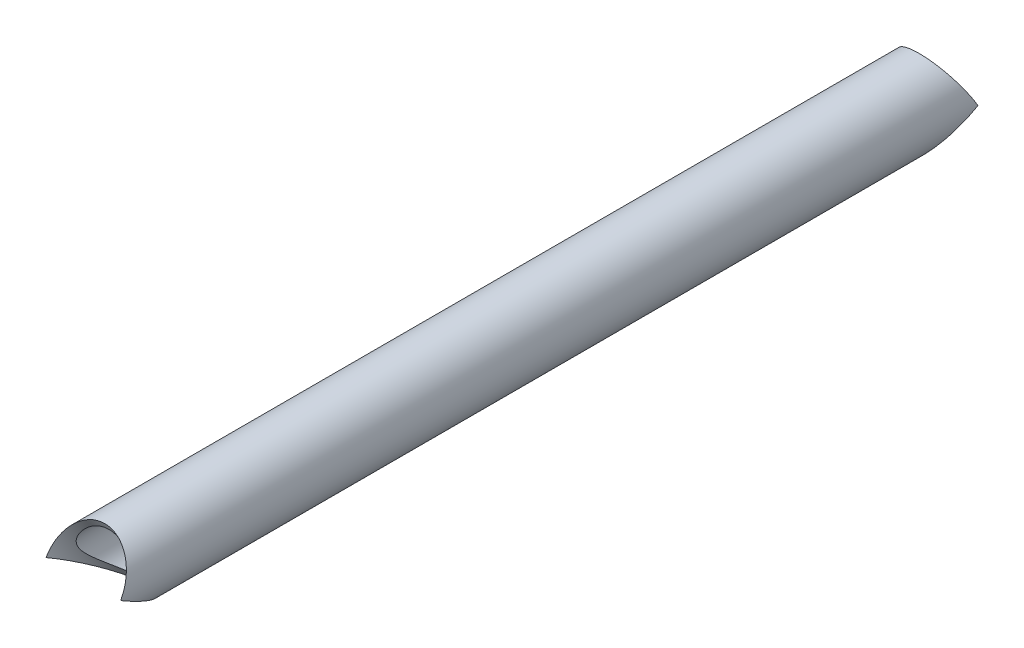
ISO-10303-21;
HEADER;
FILE_DESCRIPTION(('STEP AP214'),'2;1');
FILE_NAME('part.step','',(''),(''),'','','');
FILE_SCHEMA(('AUTOMOTIVE_DESIGN { 1 0 10303 214 1 1 1 1 }'));
ENDSEC;
DATA;
#1=APPLICATION_CONTEXT('core data for automotive mechanical design processes');
#2=APPLICATION_PROTOCOL_DEFINITION('international standard','automotive_design',2000,#1);
#3=PRODUCT_CONTEXT('',#1,'mechanical');
#4=PRODUCT('Part','Part','',(#3));
#5=PRODUCT_RELATED_PRODUCT_CATEGORY('part','',(#4));
#6=PRODUCT_DEFINITION_FORMATION('','',#4);
#7=PRODUCT_DEFINITION_CONTEXT('part definition',#1,'design');
#8=PRODUCT_DEFINITION('design','',#6,#7);
#9=PRODUCT_DEFINITION_SHAPE('','',#8);
#10=(LENGTH_UNIT() NAMED_UNIT(*) SI_UNIT(.MILLI.,.METRE.));
#11=(NAMED_UNIT(*) PLANE_ANGLE_UNIT() SI_UNIT($,.RADIAN.));
#12=(NAMED_UNIT(*) SI_UNIT($,.STERADIAN.) SOLID_ANGLE_UNIT());
#13=UNCERTAINTY_MEASURE_WITH_UNIT(LENGTH_MEASURE(1.E-05),#10,'distance_accuracy_value','');
#14=(GEOMETRIC_REPRESENTATION_CONTEXT(3) GLOBAL_UNCERTAINTY_ASSIGNED_CONTEXT((#13)) GLOBAL_UNIT_ASSIGNED_CONTEXT((#10,
#11,#12)) REPRESENTATION_CONTEXT('',''));
#15=CARTESIAN_POINT('',(0.,0.,0.));
#16=DIRECTION('',(0.,0.,1.));
#17=DIRECTION('',(1.,0.,0.));
#18=AXIS2_PLACEMENT_3D('',#15,#16,#17);
#19=CARTESIAN_POINT('',(0.,-4.57499999978753,-134.224170550296));
#20=DIRECTION('',(0.,0.,1.));
#21=DIRECTION('',(1.,0.,0.));
#22=AXIS2_PLACEMENT_3D('',#19,#20,#21);
#23=CYLINDRICAL_SURFACE('',#22,10.65);
#24=CARTESIAN_POINT('',(0.,-4.57499999978753,-122.358622518568));
#25=DIRECTION('',(0.,0.866025403784403,0.500000000000061));
#26=DIRECTION('',(0.,-0.500000000000061,0.866025403784403));
#27=AXIS2_PLACEMENT_3D('',#24,#25,#26);
#28=ELLIPSE('',#27,21.2999999999974,10.65);
#29=CARTESIAN_POINT('',(-10.65,-4.57499999978753,-122.358622518568));
#30=VERTEX_POINT('',#29);
#31=CARTESIAN_POINT('',(10.65,-4.57499999978753,-122.358622518568));
#32=VERTEX_POINT('',#31);
#33=EDGE_CURVE('E40',#30,#32,#28,.T.);
#34=ORIENTED_EDGE('',*,*,#33,.T.);
#35=CARTESIAN_POINT('',(0.,-4.57499999978753,-122.358622518568));
#36=DIRECTION('',(0.,-0.500000000000061,0.866025403784403));
#37=DIRECTION('',(0.,0.866025403784403,0.500000000000061));
#38=AXIS2_PLACEMENT_3D('',#35,#36,#37);
#39=ELLIPSE('',#38,12.2975607337395,10.65);
#40=EDGE_CURVE('E46',#32,#30,#39,.T.);
#41=ORIENTED_EDGE('',*,*,#40,.T.);
#42=EDGE_LOOP('',(#34,#41));
#43=FACE_BOUND('',#42,.T.);
#44=CARTESIAN_POINT('',(0.,-4.57499999978753,122.358622518568));
#45=DIRECTION('',(0.,-0.866025403784403,0.500000000000061));
#46=DIRECTION('',(0.,-0.500000000000061,-0.866025403784403));
#47=AXIS2_PLACEMENT_3D('',#44,#45,#46);
#48=ELLIPSE('',#47,21.2999999999974,10.65);
#49=CARTESIAN_POINT('',(-10.65,-4.57499999978753,122.358622518568));
#50=VERTEX_POINT('',#49);
#51=CARTESIAN_POINT('',(10.65,-4.57499999978753,122.358622518568));
#52=VERTEX_POINT('',#51);
#53=EDGE_CURVE('E65',#50,#52,#48,.T.);
#54=ORIENTED_EDGE('',*,*,#53,.F.);
#55=CARTESIAN_POINT('',(0.,-4.57499999978753,122.358622518568));
#56=DIRECTION('',(0.,0.500000000000061,0.866025403784403));
#57=DIRECTION('',(0.,0.866025403784403,-0.500000000000061));
#58=AXIS2_PLACEMENT_3D('',#55,#56,#57);
#59=ELLIPSE('',#58,12.2975607337395,10.65);
#60=EDGE_CURVE('E61',#52,#50,#59,.T.);
#61=ORIENTED_EDGE('',*,*,#60,.F.);
#62=EDGE_LOOP('',(#54,#61));
#63=FACE_BOUND('',#62,.T.);
#64=ADVANCED_FACE('F35',(#43,#63),#23,.T.);
#65=CARTESIAN_POINT('',(0.,-4.57499999978753,-134.224170550296));
#66=DIRECTION('',(0.,0.,1.));
#67=DIRECTION('',(1.,0.,0.));
#68=AXIS2_PLACEMENT_3D('',#65,#66,#67);
#69=CYLINDRICAL_SURFACE('',#68,8.65);
#70=CARTESIAN_POINT('',(8.65,-4.57499999978753,-115.184595290668));
#71=CARTESIAN_POINT('',(8.64999937803326,-4.42818391782851,-115.269359582951));
#72=CARTESIAN_POINT('',(8.64626274910706,-4.27875572457402,-115.349611641541));
#73=CARTESIAN_POINT('',(8.63051404007006,-3.97515065123676,-115.499677454161));
#74=CARTESIAN_POINT('',(8.61850310980504,-3.82097443381099,-115.569492656918));
#75=CARTESIAN_POINT('',(8.58549136002908,-3.50897766796468,-115.697404729086));
#76=CARTESIAN_POINT('',(8.56450206368755,-3.35116203529276,-115.755516479015));
#77=CARTESIAN_POINT('',(8.51297710355421,-3.03302790263824,-115.859376778032));
#78=CARTESIAN_POINT('',(8.48244146927592,-2.87270941039494,-115.905125365343));
#79=CARTESIAN_POINT('',(8.41148621827915,-2.55100459486539,-115.984163592341));
#80=CARTESIAN_POINT('',(8.37105601253787,-2.38961730900032,-116.017439787035));
#81=CARTESIAN_POINT('',(8.2803069748769,-2.06761051815601,-116.071985794572));
#82=CARTESIAN_POINT('',(8.22998781020885,-1.90699103919864,-116.093255203313));
#83=CARTESIAN_POINT('',(8.11955918288833,-1.58771822942159,-116.124881415479));
#84=CARTESIAN_POINT('',(8.05943008935704,-1.4290695419311,-116.135216020047));
#85=CARTESIAN_POINT('',(7.92980127101956,-1.11529040421041,-116.146305579687));
#86=CARTESIAN_POINT('',(7.86029883349651,-0.960160987723778,-116.147057755494));
#87=CARTESIAN_POINT('',(7.69251740767304,-0.613430150721972,-116.139638484842));
#88=CARTESIAN_POINT('',(7.5915181509432,-0.423195720267686,-116.129021588862));
#89=CARTESIAN_POINT('',(7.37601667855867,-0.0513849148464291,-116.097916278314));
#90=CARTESIAN_POINT('',(7.26151062378719,0.130188977789838,-116.077425051977));
#91=CARTESIAN_POINT('',(7.01974442801424,0.483814001583903,-116.029302594631));
#92=CARTESIAN_POINT('',(6.89247464409701,0.655857778142641,-116.001665940042));
#93=CARTESIAN_POINT('',(6.62602035216088,0.989525172214685,-115.941620573317));
#94=CARTESIAN_POINT('',(6.48683667995883,1.15114951930896,-115.909212195827));
#95=CARTESIAN_POINT('',(6.19369921715696,1.46719940914524,-115.84077746214));
#96=CARTESIAN_POINT('',(6.03946719637203,1.6213517424231,-115.804681942267));
#97=CARTESIAN_POINT('',(5.71996280967908,1.91745458219681,-115.731350690768));
#98=CARTESIAN_POINT('',(5.55469039583108,2.05940503570313,-115.694114954191));
#99=CARTESIAN_POINT('',(5.21389860047887,2.33044322956149,-115.620013536865));
#100=CARTESIAN_POINT('',(5.03838164399918,2.45953399455306,-115.583147770942));
#101=CARTESIAN_POINT('',(4.67787691764106,2.70424676301921,-115.511048435588));
#102=CARTESIAN_POINT('',(4.49288897525142,2.81986852103409,-115.475814895909));
#103=CARTESIAN_POINT('',(4.08963935720715,3.05115050125581,-115.403646125226));
#104=CARTESIAN_POINT('',(3.87018262639214,3.16485316154516,-115.36708724701));
#105=CARTESIAN_POINT('',(3.42170434916093,3.37330748111037,-115.29875117079));
#106=CARTESIAN_POINT('',(3.19268197861112,3.46805750342191,-115.266974385882));
#107=CARTESIAN_POINT('',(2.72667233822049,3.63774898245599,-115.209273205541));
#108=CARTESIAN_POINT('',(2.48968464132694,3.71268937519016,-115.183349124472));
#109=CARTESIAN_POINT('',(2.00954587057521,3.84200831187236,-115.138198861622));
#110=CARTESIAN_POINT('',(1.76639521488977,3.89638824693665,-115.118972226702));
#111=CARTESIAN_POINT('',(1.28688815577942,3.9820463765204,-115.088524345823));
#112=CARTESIAN_POINT('',(1.05071773862521,4.01425324205799,-115.07698206285));
#113=CARTESIAN_POINT('',(0.576287751521718,4.05906969952122,-115.060889240509));
#114=CARTESIAN_POINT('',(0.338028232848634,4.07167977109606,-115.056338530015));
#115=CARTESIAN_POINT('',(-0.138694398066298,4.07717181040764,-115.054358695336));
#116=CARTESIAN_POINT('',(-0.377157454410708,4.07005809051707,-115.056928014441));
#117=CARTESIAN_POINT('',(-0.852499060908978,4.03618555835059,-115.069111908876));
#118=CARTESIAN_POINT('',(-1.08937763950014,4.00942709960698,-115.07872635742));
#119=CARTESIAN_POINT('',(-1.55084699910065,3.93792048431375,-115.104232336492));
#120=CARTESIAN_POINT('',(-1.7755636187999,3.89389120657831,-115.11987263369));
#121=CARTESIAN_POINT('',(-2.22033596035186,3.78830373548739,-115.157001396638));
#122=CARTESIAN_POINT('',(-2.44039182888971,3.72674609467534,-115.178489678042));
#123=CARTESIAN_POINT('',(-2.8743918221649,3.58663978925965,-115.226728859725));
#124=CARTESIAN_POINT('',(-3.08833678882607,3.50809347816174,-115.253479031008));
#125=CARTESIAN_POINT('',(-3.50884695015105,3.33462882693908,-115.311498656313));
#126=CARTESIAN_POINT('',(-3.7154119251496,3.23970999997611,-115.342768244716));
#127=CARTESIAN_POINT('',(-4.12561504865977,3.03132550301985,-115.409837232953));
#128=CARTESIAN_POINT('',(-4.32901148650182,2.9174169410633,-115.445738531183));
#129=CARTESIAN_POINT('',(-4.7256099642525,2.67381198994636,-115.520168916756));
#130=CARTESIAN_POINT('',(-4.91881176220239,2.54411522631147,-115.558698066418));
#131=CARTESIAN_POINT('',(-5.29426000335308,2.26952202344384,-115.637032028229));
#132=CARTESIAN_POINT('',(-5.4764901297915,2.12460378481456,-115.676838611637));
#133=CARTESIAN_POINT('',(-5.82873985001166,1.82050122106844,-115.755988555436));
#134=CARTESIAN_POINT('',(-5.99875927649522,1.66131670055716,-115.795331909472));
#135=CARTESIAN_POINT('',(-6.33518765877074,1.31979767164411,-115.873753491672));
#136=CARTESIAN_POINT('',(-6.50081325634466,1.13665555943424,-115.912683576386));
#137=CARTESIAN_POINT('',(-6.81634213928584,0.756141739161809,-115.98486806124));
#138=CARTESIAN_POINT('',(-6.96624167784347,0.558766658841185,-116.018121109976));
#139=CARTESIAN_POINT('',(-7.24880778217058,0.151373762699139,-116.075315328043));
#140=CARTESIAN_POINT('',(-7.38151120832292,-0.0586155499751075,-116.099276641938));
#141=CARTESIAN_POINT('',(-7.62872444595338,-0.490057474007726,-116.133719500269));
#142=CARTESIAN_POINT('',(-7.74324661530789,-0.711502162187991,-116.144210235388));
#143=CARTESIAN_POINT('',(-7.91587661528823,-1.08394120060869,-116.146466563869));
#144=CARTESIAN_POINT('',(-7.97965328460164,-1.23229882149715,-116.143523213445));
#145=CARTESIAN_POINT('',(-8.09865941914437,-1.53194667156995,-116.128671454996));
#146=CARTESIAN_POINT('',(-8.15389168150628,-1.68323592271582,-116.116765988366));
#147=CARTESIAN_POINT('',(-8.25543809691553,-1.98735751091624,-116.082863897547));
#148=CARTESIAN_POINT('',(-8.30176915263798,-2.14018633155486,-116.060886673073));
#149=CARTESIAN_POINT('',(-8.38549388456925,-2.44634433783993,-116.005998636864));
#150=CARTESIAN_POINT('',(-8.42288752849283,-2.59967352529188,-115.973087785633));
#151=CARTESIAN_POINT('',(-8.48887463244825,-2.90583736976603,-115.895832618932));
#152=CARTESIAN_POINT('',(-8.51744234753774,-3.05866931695996,-115.851455535505));
#153=CARTESIAN_POINT('',(-8.56590540255695,-3.362002990232,-115.75146979544));
#154=CARTESIAN_POINT('',(-8.58580081854741,-3.51250473673607,-115.695861237313));
#155=CARTESIAN_POINT('',(-8.61742448664859,-3.81019147234697,-115.574008714786));
#156=CARTESIAN_POINT('',(-8.62914387610778,-3.95737269542241,-115.507753304792));
#157=CARTESIAN_POINT('',(-8.64501885033618,-4.24748069406385,-115.365671481828));
#158=CARTESIAN_POINT('',(-8.64917188260002,-4.39040601791679,-115.289841848222));
#159=CARTESIAN_POINT('',(-8.65091176420886,-4.73194986356799,-115.095442482579));
#160=CARTESIAN_POINT('',(-8.64490991978812,-4.92810720200213,-114.972509514161));
#161=CARTESIAN_POINT('',(-8.62080404537331,-5.31052557364032,-114.713198540494));
#162=CARTESIAN_POINT('',(-8.60269349220144,-5.49678121420754,-114.576813322057));
#163=CARTESIAN_POINT('',(-8.55591593176149,-5.86050738577944,-114.293378957805));
#164=CARTESIAN_POINT('',(-8.52721453919814,-6.03794714098358,-114.146296343747));
#165=CARTESIAN_POINT('',(-8.46048539057334,-6.38436872164175,-113.844423533046));
#166=CARTESIAN_POINT('',(-8.4224538533154,-6.55334708446049,-113.689630231839));
#167=CARTESIAN_POINT('',(-8.33930780952947,-6.87840220783153,-113.379540475325));
#168=CARTESIAN_POINT('',(-8.29446233610359,-7.03471951579418,-113.224422399952));
#169=CARTESIAN_POINT('',(-8.19738755510059,-7.34107106220538,-112.910412577411));
#170=CARTESIAN_POINT('',(-8.1451593511144,-7.49110623538767,-112.751521397205));
#171=CARTESIAN_POINT('',(-8.03358147622644,-7.7857481982702,-112.430951737262));
#172=CARTESIAN_POINT('',(-7.97422521882754,-7.93034980273499,-112.269270799675));
#173=CARTESIAN_POINT('',(-7.84858289044829,-8.21455859783765,-111.94419577846));
#174=CARTESIAN_POINT('',(-7.78229605383354,-8.35416523438043,-111.780801507356));
#175=CARTESIAN_POINT('',(-7.64278789689211,-8.62889196654412,-111.453020171442));
#176=CARTESIAN_POINT('',(-7.56956237191914,-8.764009273919,-111.28863256191));
#177=CARTESIAN_POINT('',(-7.41613086611596,-9.03000589083587,-110.959658622605));
#178=CARTESIAN_POINT('',(-7.33592422353147,-9.16088479699427,-110.795072275454));
#179=CARTESIAN_POINT('',(-7.1684296718615,-9.41852229357201,-110.466486599006));
#180=CARTESIAN_POINT('',(-7.08114669097994,-9.54528366685799,-110.30248694283));
#181=CARTESIAN_POINT('',(-6.89920629382398,-9.79489446757355,-109.975604082763));
#182=CARTESIAN_POINT('',(-6.80454875727009,-9.91774383115193,-109.81272089713));
#183=CARTESIAN_POINT('',(-6.56519981119286,-10.2115247673278,-109.419089662994));
#184=CARTESIAN_POINT('',(-6.4164866166655,-10.3804340930315,-109.189255185855));
#185=CARTESIAN_POINT('',(-6.10210401419186,-10.710038619871,-108.735247254382));
#186=CARTESIAN_POINT('',(-5.936432047359,-10.8707325758995,-108.511074660743));
#187=CARTESIAN_POINT('',(-5.58706670598721,-11.1827156749228,-108.071455876805));
#188=CARTESIAN_POINT('',(-5.40341885193567,-11.3340270659939,-107.855989501212));
#189=CARTESIAN_POINT('',(-5.01605964051009,-11.626275897711,-107.43639426222));
#190=CARTESIAN_POINT('',(-4.81235869354437,-11.7672186554388,-107.232259601236));
#191=CARTESIAN_POINT('',(-4.46395431537833,-11.9858360007998,-106.913503767282));
#192=CARTESIAN_POINT('',(-4.32596965085854,-12.0673265351517,-106.794155605259));
#193=CARTESIAN_POINT('',(-4.04104693269514,-12.2247682170259,-106.562720595489));
#194=CARTESIAN_POINT('',(-3.89410768994091,-12.3007186258999,-106.450634716222));
#195=CARTESIAN_POINT('',(-3.43953622820845,-12.5188634309986,-106.127674094581));
#196=CARTESIAN_POINT('',(-3.11767000653627,-12.651660528872,-105.929643891487));
#197=CARTESIAN_POINT('',(-2.51329904826432,-12.8564868215799,-105.622940907413));
#198=CARTESIAN_POINT('',(-2.23837288737339,-12.9354670462491,-105.504188010366));
#199=CARTESIAN_POINT('',(-1.81149183588577,-13.0344559438192,-105.355036540102));
#200=CARTESIAN_POINT('',(-1.66677696284483,-13.0642061116125,-105.310147851528));
#201=CARTESIAN_POINT('',(-1.37323763265842,-13.1165986631685,-105.231026788349));
#202=CARTESIAN_POINT('',(-1.22441515227444,-13.1392444031762,-105.196789381972));
#203=CARTESIAN_POINT('',(-0.922228530535095,-13.1770575524397,-105.139588825089));
#204=CARTESIAN_POINT('',(-0.768835207762983,-13.1921542685189,-105.116732259101));
#205=CARTESIAN_POINT('',(-0.460111209939372,-13.2141399654113,-105.083437225818));
#206=CARTESIAN_POINT('',(-0.304780550296975,-13.2210290114643,-105.072998659817));
#207=CARTESIAN_POINT('',(0.00631804623090696,-13.2263962341463,-105.064866473382));
#208=CARTESIAN_POINT('',(0.162085851106527,-13.2248767234323,-105.067169348591));
#209=CARTESIAN_POINT('',(0.472597570432571,-13.2134770715357,-105.084439707225));
#210=CARTESIAN_POINT('',(0.627341552834102,-13.2035974909364,-105.099406341483));
#211=CARTESIAN_POINT('',(0.914629127248828,-13.1775579321688,-105.138827462022));
#212=CARTESIAN_POINT('',(1.04746675019241,-13.16236989747,-105.161812937903));
#213=CARTESIAN_POINT('',(1.31053948151333,-13.1261774916188,-105.216542934459));
#214=CARTESIAN_POINT('',(1.44077378597027,-13.1051713526657,-105.248290117323));
#215=CARTESIAN_POINT('',(1.82650942834298,-13.033997007677,-105.35575133905));
#216=CARTESIAN_POINT('',(2.07716005820092,-12.975661801231,-105.443701876901));
#217=CARTESIAN_POINT('',(2.67701044964108,-12.8087067367557,-105.694647317451));
#218=CARTESIAN_POINT('',(3.01657143771813,-12.6893597724725,-105.873450719254));
#219=CARTESIAN_POINT('',(3.49694388024296,-12.4885470084001,-106.172360442701));
#220=CARTESIAN_POINT('',(3.6524529174968,-12.4178539230088,-106.277296443481));
#221=CARTESIAN_POINT('',(3.95415605806183,-12.2701478758393,-106.495775727814));
#222=CARTESIAN_POINT('',(4.10035178316862,-12.1931360197684,-106.609317505198));
#223=CARTESIAN_POINT('',(4.47217067277701,-11.9839136249407,-106.91654415232));
#224=CARTESIAN_POINT('',(4.69046621582068,-11.8472318741004,-107.116048636398));
#225=CARTESIAN_POINT('',(5.10542040241963,-11.5621722292248,-107.528787955197));
#226=CARTESIAN_POINT('',(5.3020644582469,-11.4137865637986,-107.742031895405));
#227=CARTESIAN_POINT('',(5.67619689273711,-11.1066202485955,-108.179190065514));
#228=CARTESIAN_POINT('',(5.85361633779411,-10.9478052712788,-108.403138796496));
#229=CARTESIAN_POINT('',(6.19021131259969,-10.6213821224164,-108.858053693496));
#230=CARTESIAN_POINT('',(6.34939068740902,-10.4537758150089,-109.089018367498));
#231=CARTESIAN_POINT('',(6.61712450602692,-10.1488278052138,-109.503286919531));
#232=CARTESIAN_POINT('',(6.72902472853526,-10.0131322706414,-109.685658473889));
#233=CARTESIAN_POINT('',(6.94326792392691,-9.73679289975961,-110.052292614882));
#234=CARTESIAN_POINT('',(7.04560988610065,-9.59614854231181,-110.236555399219));
#235=CARTESIAN_POINT('',(7.24122557898454,-9.30968727094873,-110.606213334335));
#236=CARTESIAN_POINT('',(7.33449006193027,-9.16386528441821,-110.791609439563));
#237=CARTESIAN_POINT('',(7.51210861764644,-8.86692902916769,-111.162414886722));
#238=CARTESIAN_POINT('',(7.59646314201647,-8.71581502918986,-111.347824227505));
#239=CARTESIAN_POINT('',(7.75620337110361,-8.40824485920786,-111.71720792965));
#240=CARTESIAN_POINT('',(7.83161100983146,-8.25180301704611,-111.901184721975));
#241=CARTESIAN_POINT('',(7.97368173187743,-7.9325925750132,-112.267069013673));
#242=CARTESIAN_POINT('',(8.04034383363397,-7.76982326762756,-112.448976278681));
#243=CARTESIAN_POINT('',(8.16459670931701,-7.43739573445011,-112.809097529655));
#244=CARTESIAN_POINT('',(8.22219981237256,-7.26774727387101,-112.987316243524));
#245=CARTESIAN_POINT('',(8.32794134031472,-6.92039006324778,-113.338573882142));
#246=CARTESIAN_POINT('',(8.37608284212221,-6.74268395677065,-113.51161447525));
#247=CARTESIAN_POINT('',(8.45472823516461,-6.40916947821612,-113.821387897599));
#248=CARTESIAN_POINT('',(8.48684042866996,-6.25481212034765,-113.959269931842));
#249=CARTESIAN_POINT('',(8.54328935211189,-5.93898150852449,-114.228383168529));
#250=CARTESIAN_POINT('',(8.56762596647505,-5.77750814884069,-114.359614272091));
#251=CARTESIAN_POINT('',(8.60751619567126,-5.44721879344272,-114.61310351662));
#252=CARTESIAN_POINT('',(8.62309164938045,-5.27842219503451,-114.735383301947));
#253=CARTESIAN_POINT('',(8.6443326388658,-4.93273682239824,-114.968920809705));
#254=CARTESIAN_POINT('',(8.65000076614763,-4.7558501767481,-115.080181407292));
#255=CARTESIAN_POINT('',(8.65,-4.57499999978753,-115.184595290668));
#256=B_SPLINE_CURVE_WITH_KNOTS('',3,(#70,#71,#72,#73,#74,#75,#76,#77,#78,#79,#80,#81,#82,#83,
#84,#85,#86,#87,#88,#89,#90,#91,#92,#93,#94,#95,#96,#97,#98,#99,#100,#101,#102,#103,#104,#105,
#106,#107,#108,#109,#110,#111,#112,#113,#114,#115,#116,#117,#118,#119,#120,#121,#122,#123,#124,
#125,#126,#127,#128,#129,#130,#131,#132,#133,#134,#135,#136,#137,#138,#139,#140,#141,#142,#143,
#144,#145,#146,#147,#148,#149,#150,#151,#152,#153,#154,#155,#156,#157,#158,#159,#160,#161,#162,
#163,#164,#165,#166,#167,#168,#169,#170,#171,#172,#173,#174,#175,#176,#177,#178,#179,#180,#181,
#182,#183,#184,#185,#186,#187,#188,#189,#190,#191,#192,#193,#194,#195,#196,#197,#198,#199,#200,
#201,#202,#203,#204,#205,#206,#207,#208,#209,#210,#211,#212,#213,#214,#215,#216,#217,#218,#219,
#220,#221,#222,#223,#224,#225,#226,#227,#228,#229,#230,#231,#232,#233,#234,#235,#236,#237,#238,
#239,#240,#241,#242,#243,#244,#245,#246,#247,#248,#249,#250,#251,#252,#253,#254,#255),
.UNSPECIFIED.,.T.,.F.,(4,2,2,2,2,2,2,2,2,2,2,2,2,2,2,2,2,2,2,2,2,2,2,2,2,2,2,2,2,2,2,2,2,2,2,2,
2,2,2,2,2,2,2,2,2,2,2,2,2,2,2,2,2,2,2,2,2,2,2,2,2,2,2,2,2,2,2,2,2,2,2,2,2,2,2,2,2,2,2,2,2,2,2,2,
2,2,2,2,2,2,2,2,4),(0.,0.508445067700349,1.01681949312026,1.52454340032986,2.03226573787247,
2.54053382673745,3.04881902097656,3.55813412185337,4.06759693996555,4.71359002947274,
5.35976717786703,6.00643624012441,6.65305997254504,7.31551844685103,7.97797979789366,
8.64028496620576,9.30260220250591,10.0512091879155,10.7998808036047,11.5485926227779,
12.2972537751971,13.0122575701419,13.727243864449,14.4420738478249,15.1568909672333,
15.8446653307739,16.5324180161267,17.220075485415,17.9077534057859,18.6145823037833,
19.3214279700608,20.0293001149053,20.7371819564205,21.4861817527542,22.2353595985677,
22.9829040159493,23.7299381285012,24.2140392664685,24.6979815901785,25.1809956610562,
25.6640114767331,26.1484232132306,26.6328307010898,27.1177624646541,27.6028577893435,
28.2964167818696,28.9903497083936,29.6865557409419,30.3830443900297,31.056994465983,
31.7308439043487,32.4053208577863,33.0798724008733,33.754835349197,34.4298623484515,
35.1044232089342,35.7789950738535,36.7434305731184,37.708011809881,38.6702106916392,
39.6319126633936,40.2309613246269,40.8300897097658,42.0261773485567,42.9515592316293,
43.4142860297687,43.8767938980607,44.3435554209346,44.8103132336665,45.276942677516,
45.7435408340747,46.1500870679647,46.5567569645807,47.3697458590117,48.5683011522666,
49.1693990091061,49.7703919045983,50.7462014804335,51.7226645377543,52.7025204724634,
53.6821694691645,54.4420360299657,55.2019828498199,55.9626959419759,56.7233704590089,
57.4821398028627,58.2409942350115,58.9988067717561,59.7563724579483,60.3844095628075,
61.0124560021505,61.6389298975941,62.2652398987969),.UNSPECIFIED.);
#257=CARTESIAN_POINT('',(8.65,-4.57499999978753,-115.184595290668));
#258=VERTEX_POINT('',#257);
#259=EDGE_CURVE('E11',#258,#258,#256,.T.);
#260=ORIENTED_EDGE('',*,*,#259,.F.);
#261=EDGE_LOOP('',(#260));
#262=FACE_BOUND('',#261,.T.);
#263=CARTESIAN_POINT('',(8.65,-4.57499999978753,115.184595290668));
#264=CARTESIAN_POINT('',(8.64999937803326,-4.42818391782851,115.269359582951));
#265=CARTESIAN_POINT('',(8.64626274910706,-4.27875572457402,115.349611641541));
#266=CARTESIAN_POINT('',(8.63051404007006,-3.97515065123676,115.499677454161));
#267=CARTESIAN_POINT('',(8.61850310980504,-3.82097443381099,115.569492656918));
#268=CARTESIAN_POINT('',(8.58549136002908,-3.50897766796468,115.697404729086));
#269=CARTESIAN_POINT('',(8.56450206368755,-3.35116203529276,115.755516479015));
#270=CARTESIAN_POINT('',(8.51297710355421,-3.03302790263824,115.859376778032));
#271=CARTESIAN_POINT('',(8.48244146927592,-2.87270941039494,115.905125365343));
#272=CARTESIAN_POINT('',(8.41148621827915,-2.55100459486539,115.984163592341));
#273=CARTESIAN_POINT('',(8.37105601253787,-2.38961730900032,116.017439787035));
#274=CARTESIAN_POINT('',(8.2803069748769,-2.06761051815601,116.071985794572));
#275=CARTESIAN_POINT('',(8.22998781020885,-1.90699103919864,116.093255203313));
#276=CARTESIAN_POINT('',(8.11955918288833,-1.58771822942159,116.124881415479));
#277=CARTESIAN_POINT('',(8.05943008935704,-1.4290695419311,116.135216020047));
#278=CARTESIAN_POINT('',(7.92980127101956,-1.11529040421041,116.146305579687));
#279=CARTESIAN_POINT('',(7.86029883349651,-0.960160987723778,116.147057755494));
#280=CARTESIAN_POINT('',(7.69251740767304,-0.613430150721972,116.139638484842));
#281=CARTESIAN_POINT('',(7.5915181509432,-0.423195720267686,116.129021588862));
#282=CARTESIAN_POINT('',(7.37601667855867,-0.0513849148464291,116.097916278314));
#283=CARTESIAN_POINT('',(7.26151062378719,0.130188977789838,116.077425051977));
#284=CARTESIAN_POINT('',(7.01974442801424,0.483814001583903,116.029302594631));
#285=CARTESIAN_POINT('',(6.89247464409701,0.655857778142641,116.001665940042));
#286=CARTESIAN_POINT('',(6.62602035216088,0.989525172214685,115.941620573317));
#287=CARTESIAN_POINT('',(6.48683667995883,1.15114951930896,115.909212195827));
#288=CARTESIAN_POINT('',(6.19369921715696,1.46719940914524,115.84077746214));
#289=CARTESIAN_POINT('',(6.03946719637203,1.6213517424231,115.804681942267));
#290=CARTESIAN_POINT('',(5.71996280967908,1.91745458219681,115.731350690768));
#291=CARTESIAN_POINT('',(5.55469039583108,2.05940503570313,115.694114954191));
#292=CARTESIAN_POINT('',(5.21389860047887,2.33044322956149,115.620013536865));
#293=CARTESIAN_POINT('',(5.03838164399918,2.45953399455306,115.583147770942));
#294=CARTESIAN_POINT('',(4.67787691764106,2.70424676301921,115.511048435588));
#295=CARTESIAN_POINT('',(4.49288897525142,2.81986852103409,115.475814895909));
#296=CARTESIAN_POINT('',(4.08963935720715,3.05115050125581,115.403646125226));
#297=CARTESIAN_POINT('',(3.87018262639214,3.16485316154516,115.36708724701));
#298=CARTESIAN_POINT('',(3.42170434916093,3.37330748111037,115.29875117079));
#299=CARTESIAN_POINT('',(3.19268197861112,3.46805750342191,115.266974385882));
#300=CARTESIAN_POINT('',(2.72667233822049,3.63774898245599,115.209273205541));
#301=CARTESIAN_POINT('',(2.48968464132694,3.71268937519016,115.183349124472));
#302=CARTESIAN_POINT('',(2.00954587057521,3.84200831187236,115.138198861622));
#303=CARTESIAN_POINT('',(1.76639521488977,3.89638824693665,115.118972226702));
#304=CARTESIAN_POINT('',(1.28688815577942,3.9820463765204,115.088524345823));
#305=CARTESIAN_POINT('',(1.05071773862521,4.01425324205799,115.07698206285));
#306=CARTESIAN_POINT('',(0.576287751521718,4.05906969952122,115.060889240509));
#307=CARTESIAN_POINT('',(0.338028232848634,4.07167977109606,115.056338530015));
#308=CARTESIAN_POINT('',(-0.138694398066298,4.07717181040764,115.054358695336));
#309=CARTESIAN_POINT('',(-0.377157454410708,4.07005809051707,115.056928014441));
#310=CARTESIAN_POINT('',(-0.852499060908978,4.03618555835059,115.069111908876));
#311=CARTESIAN_POINT('',(-1.08937763950014,4.00942709960698,115.07872635742));
#312=CARTESIAN_POINT('',(-1.55084699910065,3.93792048431375,115.104232336492));
#313=CARTESIAN_POINT('',(-1.7755636187999,3.89389120657831,115.11987263369));
#314=CARTESIAN_POINT('',(-2.22033596035186,3.78830373548739,115.157001396638));
#315=CARTESIAN_POINT('',(-2.44039182888971,3.72674609467534,115.178489678042));
#316=CARTESIAN_POINT('',(-2.8743918221649,3.58663978925965,115.226728859725));
#317=CARTESIAN_POINT('',(-3.08833678882607,3.50809347816174,115.253479031008));
#318=CARTESIAN_POINT('',(-3.50884695015105,3.33462882693908,115.311498656313));
#319=CARTESIAN_POINT('',(-3.7154119251496,3.23970999997611,115.342768244716));
#320=CARTESIAN_POINT('',(-4.12561504865977,3.03132550301985,115.409837232953));
#321=CARTESIAN_POINT('',(-4.32901148650182,2.9174169410633,115.445738531183));
#322=CARTESIAN_POINT('',(-4.7256099642525,2.67381198994636,115.520168916756));
#323=CARTESIAN_POINT('',(-4.91881176220239,2.54411522631147,115.558698066418));
#324=CARTESIAN_POINT('',(-5.29426000335308,2.26952202344384,115.637032028229));
#325=CARTESIAN_POINT('',(-5.4764901297915,2.12460378481456,115.676838611637));
#326=CARTESIAN_POINT('',(-5.82873985001166,1.82050122106844,115.755988555436));
#327=CARTESIAN_POINT('',(-5.99875927649522,1.66131670055716,115.795331909472));
#328=CARTESIAN_POINT('',(-6.33518765877074,1.31979767164411,115.873753491672));
#329=CARTESIAN_POINT('',(-6.50081325634466,1.13665555943424,115.912683576386));
#330=CARTESIAN_POINT('',(-6.81634213928584,0.756141739161809,115.98486806124));
#331=CARTESIAN_POINT('',(-6.96624167784347,0.558766658841185,116.018121109976));
#332=CARTESIAN_POINT('',(-7.24880778217058,0.151373762699139,116.075315328043));
#333=CARTESIAN_POINT('',(-7.38151120832292,-0.0586155499751075,116.099276641938));
#334=CARTESIAN_POINT('',(-7.62872444595338,-0.490057474007726,116.133719500269));
#335=CARTESIAN_POINT('',(-7.74324661530789,-0.711502162187991,116.144210235388));
#336=CARTESIAN_POINT('',(-7.91587661528823,-1.08394120060869,116.146466563869));
#337=CARTESIAN_POINT('',(-7.97965328460164,-1.23229882149715,116.143523213445));
#338=CARTESIAN_POINT('',(-8.09865941914437,-1.53194667156995,116.128671454996));
#339=CARTESIAN_POINT('',(-8.15389168150628,-1.68323592271582,116.116765988366));
#340=CARTESIAN_POINT('',(-8.25543809691553,-1.98735751091624,116.082863897547));
#341=CARTESIAN_POINT('',(-8.30176915263798,-2.14018633155486,116.060886673073));
#342=CARTESIAN_POINT('',(-8.38549388456925,-2.44634433783993,116.005998636864));
#343=CARTESIAN_POINT('',(-8.42288752849283,-2.59967352529188,115.973087785633));
#344=CARTESIAN_POINT('',(-8.48887463244825,-2.90583736976603,115.895832618932));
#345=CARTESIAN_POINT('',(-8.51744234753774,-3.05866931695996,115.851455535505));
#346=CARTESIAN_POINT('',(-8.56590540255695,-3.362002990232,115.75146979544));
#347=CARTESIAN_POINT('',(-8.58580081854741,-3.51250473673607,115.695861237313));
#348=CARTESIAN_POINT('',(-8.61742448664859,-3.81019147234697,115.574008714786));
#349=CARTESIAN_POINT('',(-8.62914387610778,-3.95737269542241,115.507753304792));
#350=CARTESIAN_POINT('',(-8.64501885033618,-4.24748069406385,115.365671481828));
#351=CARTESIAN_POINT('',(-8.64917188260002,-4.39040601791679,115.289841848222));
#352=CARTESIAN_POINT('',(-8.65091176420886,-4.73194986356799,115.095442482579));
#353=CARTESIAN_POINT('',(-8.64490991978812,-4.92810720200213,114.972509514161));
#354=CARTESIAN_POINT('',(-8.62080404537331,-5.31052557364032,114.713198540494));
#355=CARTESIAN_POINT('',(-8.60269349220144,-5.49678121420754,114.576813322057));
#356=CARTESIAN_POINT('',(-8.55591593176149,-5.86050738577944,114.293378957805));
#357=CARTESIAN_POINT('',(-8.52721453919814,-6.03794714098358,114.146296343747));
#358=CARTESIAN_POINT('',(-8.46048539057334,-6.38436872164175,113.844423533046));
#359=CARTESIAN_POINT('',(-8.4224538533154,-6.55334708446049,113.689630231839));
#360=CARTESIAN_POINT('',(-8.33930780952947,-6.87840220783153,113.379540475325));
#361=CARTESIAN_POINT('',(-8.29446233610359,-7.03471951579418,113.224422399952));
#362=CARTESIAN_POINT('',(-8.19738755510059,-7.34107106220538,112.910412577411));
#363=CARTESIAN_POINT('',(-8.1451593511144,-7.49110623538767,112.751521397205));
#364=CARTESIAN_POINT('',(-8.03358147622644,-7.7857481982702,112.430951737262));
#365=CARTESIAN_POINT('',(-7.97422521882754,-7.93034980273499,112.269270799675));
#366=CARTESIAN_POINT('',(-7.84858289044829,-8.21455859783765,111.94419577846));
#367=CARTESIAN_POINT('',(-7.78229605383354,-8.35416523438043,111.780801507356));
#368=CARTESIAN_POINT('',(-7.64278789689211,-8.62889196654412,111.453020171442));
#369=CARTESIAN_POINT('',(-7.56956237191914,-8.764009273919,111.28863256191));
#370=CARTESIAN_POINT('',(-7.41613086611596,-9.03000589083587,110.959658622605));
#371=CARTESIAN_POINT('',(-7.33592422353147,-9.16088479699427,110.795072275454));
#372=CARTESIAN_POINT('',(-7.1684296718615,-9.41852229357201,110.466486599006));
#373=CARTESIAN_POINT('',(-7.08114669097994,-9.54528366685799,110.30248694283));
#374=CARTESIAN_POINT('',(-6.89920629382398,-9.79489446757355,109.975604082763));
#375=CARTESIAN_POINT('',(-6.80454875727009,-9.91774383115193,109.81272089713));
#376=CARTESIAN_POINT('',(-6.56519981119286,-10.2115247673278,109.419089662994));
#377=CARTESIAN_POINT('',(-6.4164866166655,-10.3804340930315,109.189255185855));
#378=CARTESIAN_POINT('',(-6.10210401419186,-10.710038619871,108.735247254382));
#379=CARTESIAN_POINT('',(-5.936432047359,-10.8707325758995,108.511074660743));
#380=CARTESIAN_POINT('',(-5.58706670598721,-11.1827156749228,108.071455876805));
#381=CARTESIAN_POINT('',(-5.40341885193567,-11.3340270659939,107.855989501212));
#382=CARTESIAN_POINT('',(-5.01605964051009,-11.626275897711,107.43639426222));
#383=CARTESIAN_POINT('',(-4.81235869354437,-11.7672186554388,107.232259601236));
#384=CARTESIAN_POINT('',(-4.46395431537833,-11.9858360007998,106.913503767282));
#385=CARTESIAN_POINT('',(-4.32596965085854,-12.0673265351517,106.794155605259));
#386=CARTESIAN_POINT('',(-4.04104693269514,-12.2247682170259,106.562720595489));
#387=CARTESIAN_POINT('',(-3.89410768994091,-12.3007186258999,106.450634716222));
#388=CARTESIAN_POINT('',(-3.43953622820845,-12.5188634309986,106.127674094581));
#389=CARTESIAN_POINT('',(-3.11767000653627,-12.651660528872,105.929643891487));
#390=CARTESIAN_POINT('',(-2.51329904826432,-12.8564868215799,105.622940907413));
#391=CARTESIAN_POINT('',(-2.23837288737339,-12.9354670462491,105.504188010366));
#392=CARTESIAN_POINT('',(-1.81149183588577,-13.0344559438192,105.355036540102));
#393=CARTESIAN_POINT('',(-1.66677696284483,-13.0642061116125,105.310147851528));
#394=CARTESIAN_POINT('',(-1.37323763265842,-13.1165986631685,105.231026788349));
#395=CARTESIAN_POINT('',(-1.22441515227444,-13.1392444031762,105.196789381972));
#396=CARTESIAN_POINT('',(-0.922228530535095,-13.1770575524397,105.139588825089));
#397=CARTESIAN_POINT('',(-0.768835207762983,-13.1921542685189,105.116732259101));
#398=CARTESIAN_POINT('',(-0.460111209939372,-13.2141399654113,105.083437225818));
#399=CARTESIAN_POINT('',(-0.304780550296975,-13.2210290114643,105.072998659817));
#400=CARTESIAN_POINT('',(0.00631804623090696,-13.2263962341463,105.064866473382));
#401=CARTESIAN_POINT('',(0.162085851106527,-13.2248767234323,105.067169348591));
#402=CARTESIAN_POINT('',(0.472597570432571,-13.2134770715357,105.084439707225));
#403=CARTESIAN_POINT('',(0.627341552834102,-13.2035974909364,105.099406341483));
#404=CARTESIAN_POINT('',(0.914629127248828,-13.1775579321688,105.138827462022));
#405=CARTESIAN_POINT('',(1.04746675019241,-13.16236989747,105.161812937903));
#406=CARTESIAN_POINT('',(1.31053948151333,-13.1261774916188,105.216542934459));
#407=CARTESIAN_POINT('',(1.44077378597027,-13.1051713526657,105.248290117323));
#408=CARTESIAN_POINT('',(1.82650942834298,-13.033997007677,105.35575133905));
#409=CARTESIAN_POINT('',(2.07716005820092,-12.975661801231,105.443701876901));
#410=CARTESIAN_POINT('',(2.67701044964108,-12.8087067367557,105.694647317451));
#411=CARTESIAN_POINT('',(3.01657143771813,-12.6893597724725,105.873450719254));
#412=CARTESIAN_POINT('',(3.49694388024296,-12.4885470084001,106.172360442701));
#413=CARTESIAN_POINT('',(3.6524529174968,-12.4178539230088,106.277296443481));
#414=CARTESIAN_POINT('',(3.95415605806183,-12.2701478758393,106.495775727814));
#415=CARTESIAN_POINT('',(4.10035178316862,-12.1931360197684,106.609317505198));
#416=CARTESIAN_POINT('',(4.47217067277701,-11.9839136249407,106.91654415232));
#417=CARTESIAN_POINT('',(4.69046621582068,-11.8472318741004,107.116048636398));
#418=CARTESIAN_POINT('',(5.10542040241963,-11.5621722292248,107.528787955197));
#419=CARTESIAN_POINT('',(5.3020644582469,-11.4137865637986,107.742031895405));
#420=CARTESIAN_POINT('',(5.67619689273711,-11.1066202485955,108.179190065514));
#421=CARTESIAN_POINT('',(5.85361633779411,-10.9478052712788,108.403138796496));
#422=CARTESIAN_POINT('',(6.19021131259969,-10.6213821224164,108.858053693496));
#423=CARTESIAN_POINT('',(6.34939068740902,-10.4537758150089,109.089018367498));
#424=CARTESIAN_POINT('',(6.61712450602692,-10.1488278052138,109.503286919531));
#425=CARTESIAN_POINT('',(6.72902472853526,-10.0131322706414,109.685658473889));
#426=CARTESIAN_POINT('',(6.94326792392691,-9.73679289975961,110.052292614882));
#427=CARTESIAN_POINT('',(7.04560988610065,-9.59614854231181,110.236555399219));
#428=CARTESIAN_POINT('',(7.24122557898454,-9.30968727094873,110.606213334335));
#429=CARTESIAN_POINT('',(7.33449006193027,-9.16386528441821,110.791609439563));
#430=CARTESIAN_POINT('',(7.51210861764644,-8.86692902916769,111.162414886722));
#431=CARTESIAN_POINT('',(7.59646314201647,-8.71581502918986,111.347824227505));
#432=CARTESIAN_POINT('',(7.75620337110361,-8.40824485920786,111.71720792965));
#433=CARTESIAN_POINT('',(7.83161100983146,-8.25180301704611,111.901184721975));
#434=CARTESIAN_POINT('',(7.97368173187743,-7.9325925750132,112.267069013673));
#435=CARTESIAN_POINT('',(8.04034383363397,-7.76982326762756,112.448976278681));
#436=CARTESIAN_POINT('',(8.16459670931701,-7.43739573445011,112.809097529655));
#437=CARTESIAN_POINT('',(8.22219981237256,-7.26774727387101,112.987316243524));
#438=CARTESIAN_POINT('',(8.32794134031472,-6.92039006324778,113.338573882142));
#439=CARTESIAN_POINT('',(8.37608284212221,-6.74268395677065,113.51161447525));
#440=CARTESIAN_POINT('',(8.45472823516461,-6.40916947821612,113.821387897599));
#441=CARTESIAN_POINT('',(8.48684042866996,-6.25481212034765,113.959269931842));
#442=CARTESIAN_POINT('',(8.54328935211189,-5.93898150852449,114.228383168529));
#443=CARTESIAN_POINT('',(8.56762596647505,-5.77750814884069,114.359614272091));
#444=CARTESIAN_POINT('',(8.60751619567126,-5.44721879344272,114.61310351662));
#445=CARTESIAN_POINT('',(8.62309164938045,-5.27842219503451,114.735383301947));
#446=CARTESIAN_POINT('',(8.6443326388658,-4.93273682239824,114.968920809705));
#447=CARTESIAN_POINT('',(8.65000076614763,-4.7558501767481,115.080181407292));
#448=CARTESIAN_POINT('',(8.65,-4.57499999978753,115.184595290668));
#449=B_SPLINE_CURVE_WITH_KNOTS('',3,(#263,#264,#265,#266,#267,#268,#269,#270,#271,#272,#273,
#274,#275,#276,#277,#278,#279,#280,#281,#282,#283,#284,#285,#286,#287,#288,#289,#290,#291,#292,
#293,#294,#295,#296,#297,#298,#299,#300,#301,#302,#303,#304,#305,#306,#307,#308,#309,#310,#311,
#312,#313,#314,#315,#316,#317,#318,#319,#320,#321,#322,#323,#324,#325,#326,#327,#328,#329,#330,
#331,#332,#333,#334,#335,#336,#337,#338,#339,#340,#341,#342,#343,#344,#345,#346,#347,#348,#349,
#350,#351,#352,#353,#354,#355,#356,#357,#358,#359,#360,#361,#362,#363,#364,#365,#366,#367,#368,
#369,#370,#371,#372,#373,#374,#375,#376,#377,#378,#379,#380,#381,#382,#383,#384,#385,#386,#387,
#388,#389,#390,#391,#392,#393,#394,#395,#396,#397,#398,#399,#400,#401,#402,#403,#404,#405,#406,
#407,#408,#409,#410,#411,#412,#413,#414,#415,#416,#417,#418,#419,#420,#421,#422,#423,#424,#425,
#426,#427,#428,#429,#430,#431,#432,#433,#434,#435,#436,#437,#438,#439,#440,#441,#442,#443,#444,
#445,#446,#447,#448),.UNSPECIFIED.,.T.,.F.,(4,2,2,2,2,2,2,2,2,2,2,2,2,2,2,2,2,2,2,2,2,2,2,2,2,2,
2,2,2,2,2,2,2,2,2,2,2,2,2,2,2,2,2,2,2,2,2,2,2,2,2,2,2,2,2,2,2,2,2,2,2,2,2,2,2,2,2,2,2,2,2,2,2,2,
2,2,2,2,2,2,2,2,2,2,2,2,2,2,2,2,2,2,4),(0.,0.508445067700349,1.01681949312026,1.52454340032986,
2.03226573787247,2.54053382673745,3.04881902097656,3.55813412185337,4.06759693996555,
4.71359002947274,5.35976717786703,6.00643624012441,6.65305997254504,7.31551844685103,
7.97797979789366,8.64028496620576,9.30260220250591,10.0512091879155,10.7998808036047,
11.5485926227779,12.2972537751971,13.0122575701419,13.727243864449,14.4420738478249,
15.1568909672333,15.8446653307739,16.5324180161267,17.220075485415,17.9077534057859,
18.6145823037833,19.3214279700608,20.0293001149053,20.7371819564205,21.4861817527542,
22.2353595985677,22.9829040159493,23.7299381285012,24.2140392664685,24.6979815901785,
25.1809956610562,25.6640114767331,26.1484232132306,26.6328307010898,27.1177624646541,
27.6028577893435,28.2964167818696,28.9903497083936,29.6865557409419,30.3830443900297,
31.056994465983,31.7308439043487,32.4053208577863,33.0798724008733,33.754835349197,
34.4298623484515,35.1044232089342,35.7789950738535,36.7434305731184,37.708011809881,
38.6702106916392,39.6319126633936,40.2309613246269,40.8300897097658,42.0261773485567,
42.9515592316293,43.4142860297687,43.8767938980607,44.3435554209346,44.8103132336665,
45.276942677516,45.7435408340747,46.1500870679647,46.5567569645807,47.3697458590117,
48.5683011522666,49.1693990091061,49.7703919045983,50.7462014804335,51.7226645377543,
52.7025204724634,53.6821694691645,54.4420360299657,55.2019828498199,55.9626959419759,
56.7233704590089,57.4821398028627,58.2409942350115,58.9988067717561,59.7563724579483,
60.3844095628075,61.0124560021505,61.6389298975941,62.2652398987969),.UNSPECIFIED.);
#450=CARTESIAN_POINT('',(8.65,-4.57499999978753,115.184595290668));
#451=VERTEX_POINT('',#450);
#452=EDGE_CURVE('E67',#451,#451,#449,.T.);
#453=ORIENTED_EDGE('',*,*,#452,.T.);
#454=EDGE_LOOP('',(#453));
#455=FACE_BOUND('',#454,.T.);
#456=ADVANCED_FACE('F74',(#262,#455),#69,.F.);
#457=CARTESIAN_POINT('',(0.,5.41233724504764E-12,-124.999999999991));
#458=DIRECTION('',(0.,-0.86602540378451,0.499999999999877));
#459=DIRECTION('',(-1.,0.,0.));
#460=AXIS2_PLACEMENT_3D('',#457,#458,#459);
#461=CYLINDRICAL_SURFACE('',#460,10.65);
#462=ORIENTED_EDGE('',*,*,#40,.F.);
#463=ORIENTED_EDGE('',*,*,#33,.F.);
#464=EDGE_LOOP('',(#462,#463));
#465=FACE_BOUND('',#464,.T.);
#466=ORIENTED_EDGE('',*,*,#259,.T.);
#467=EDGE_LOOP('',(#466));
#468=FACE_BOUND('',#467,.T.);
#469=ADVANCED_FACE('F37',(#465,#468),#461,.F.);
#470=CARTESIAN_POINT('',(0.,5.41233724504764E-12,124.999999999991));
#471=DIRECTION('',(0.,-0.86602540378451,-0.499999999999877));
#472=DIRECTION('',(-1.,0.,0.));
#473=AXIS2_PLACEMENT_3D('',#470,#471,#472);
#474=CYLINDRICAL_SURFACE('',#473,10.65);
#475=ORIENTED_EDGE('',*,*,#60,.T.);
#476=ORIENTED_EDGE('',*,*,#53,.T.);
#477=EDGE_LOOP('',(#475,#476));
#478=FACE_BOUND('',#477,.T.);
#479=ORIENTED_EDGE('',*,*,#452,.F.);
#480=EDGE_LOOP('',(#479));
#481=FACE_BOUND('',#480,.T.);
#482=ADVANCED_FACE('F63',(#478,#481),#474,.F.);
#483=CLOSED_SHELL('',(#64,#456,#469,#482));
#484=MANIFOLD_SOLID_BREP('B2',#483);
#485=ADVANCED_BREP_SHAPE_REPRESENTATION('',(#18,#484),#14);
#486=SHAPE_DEFINITION_REPRESENTATION(#9,#485);
ENDSEC;
END-ISO-10303-21;
